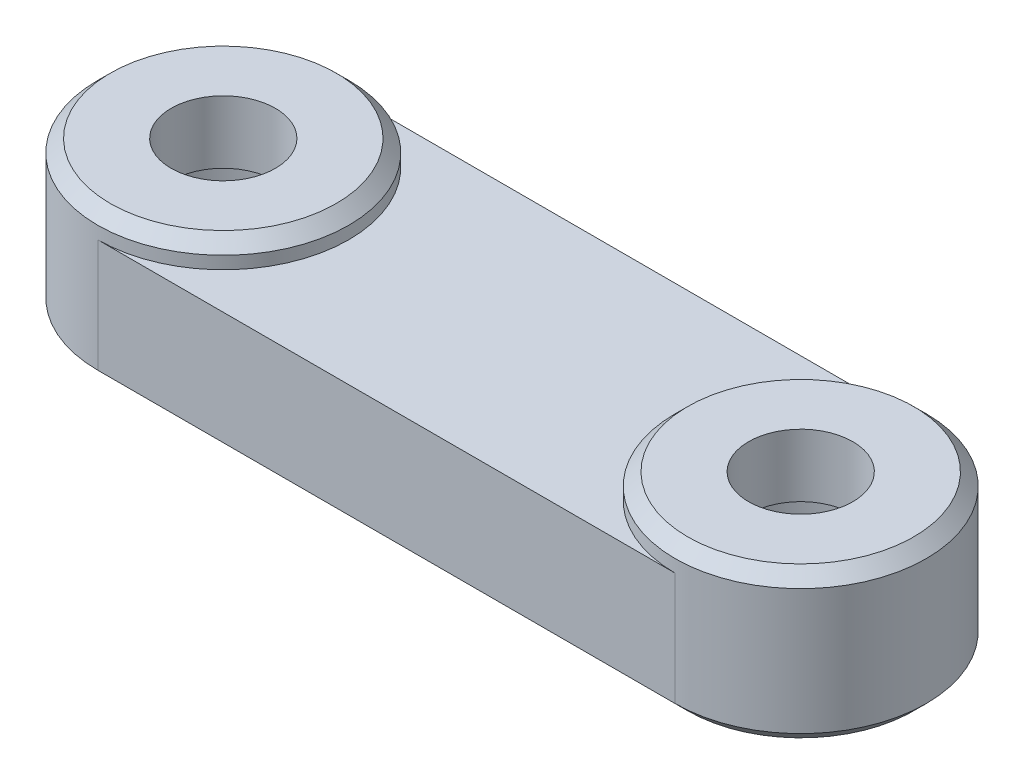
ISO-10303-21;
HEADER;
FILE_DESCRIPTION(('STEP AP214'),'2;1');
FILE_NAME('part.step','',(''),(''),'','','');
FILE_SCHEMA(('AUTOMOTIVE_DESIGN { 1 0 10303 214 1 1 1 1 }'));
ENDSEC;
DATA;
#1=APPLICATION_CONTEXT('core data for automotive mechanical design processes');
#2=APPLICATION_PROTOCOL_DEFINITION('international standard','automotive_design',2000,#1);
#3=PRODUCT_CONTEXT('',#1,'mechanical');
#4=PRODUCT('Part','Part','',(#3));
#5=PRODUCT_RELATED_PRODUCT_CATEGORY('part','',(#4));
#6=PRODUCT_DEFINITION_FORMATION('','',#4);
#7=PRODUCT_DEFINITION_CONTEXT('part definition',#1,'design');
#8=PRODUCT_DEFINITION('design','',#6,#7);
#9=PRODUCT_DEFINITION_SHAPE('','',#8);
#10=(LENGTH_UNIT() NAMED_UNIT(*) SI_UNIT(.MILLI.,.METRE.));
#11=(NAMED_UNIT(*) PLANE_ANGLE_UNIT() SI_UNIT($,.RADIAN.));
#12=(NAMED_UNIT(*) SI_UNIT($,.STERADIAN.) SOLID_ANGLE_UNIT());
#13=UNCERTAINTY_MEASURE_WITH_UNIT(LENGTH_MEASURE(1.E-05),#10,'distance_accuracy_value','');
#14=(GEOMETRIC_REPRESENTATION_CONTEXT(3) GLOBAL_UNCERTAINTY_ASSIGNED_CONTEXT((#13)) GLOBAL_UNIT_ASSIGNED_CONTEXT((#10,
#11,#12)) REPRESENTATION_CONTEXT('',''));
#15=CARTESIAN_POINT('',(0.,0.,0.));
#16=DIRECTION('',(0.,0.,1.));
#17=DIRECTION('',(1.,0.,0.));
#18=AXIS2_PLACEMENT_3D('',#15,#16,#17);
#19=CARTESIAN_POINT('',(0.,6.,5.));
#20=DIRECTION('',(0.,0.,-1.));
#21=DIRECTION('',(-1.,0.,0.));
#22=AXIS2_PLACEMENT_3D('',#19,#20,#21);
#23=PLANE('',#22);
#24=DIRECTION('',(0.,-1.,0.));
#25=VECTOR('',#24,1.);
#26=CARTESIAN_POINT('',(0.,6.,5.));
#27=LINE('',#26,#25);
#28=CARTESIAN_POINT('',(0.,5.,5.));
#29=VERTEX_POINT('',#28);
#30=CARTESIAN_POINT('',(0.,0.49999999999999,5.));
#31=VERTEX_POINT('',#30);
#32=EDGE_CURVE('E113',#29,#31,#27,.T.);
#33=ORIENTED_EDGE('',*,*,#32,.T.);
#34=DIRECTION('',(1.,0.,0.));
#35=VECTOR('',#34,1.);
#36=CARTESIAN_POINT('',(0.,0.49999999999999,5.));
#37=LINE('',#36,#35);
#38=CARTESIAN_POINT('',(23.,0.49999999999999,5.));
#39=VERTEX_POINT('',#38);
#40=EDGE_CURVE('E56',#31,#39,#37,.T.);
#41=ORIENTED_EDGE('',*,*,#40,.T.);
#42=DIRECTION('',(0.,-1.,0.));
#43=VECTOR('',#42,1.);
#44=CARTESIAN_POINT('',(23.,6.,5.));
#45=LINE('',#44,#43);
#46=CARTESIAN_POINT('',(23.,5.,5.));
#47=VERTEX_POINT('',#46);
#48=EDGE_CURVE('E108',#47,#39,#45,.T.);
#49=ORIENTED_EDGE('',*,*,#48,.F.);
#50=DIRECTION('',(1.,0.,0.));
#51=VECTOR('',#50,1.);
#52=CARTESIAN_POINT('',(0.,5.,5.));
#53=LINE('',#52,#51);
#54=EDGE_CURVE('E96',#29,#47,#53,.T.);
#55=ORIENTED_EDGE('',*,*,#54,.F.);
#56=EDGE_LOOP('',(#33,#41,#49,#55));
#57=FACE_BOUND('',#56,.T.);
#58=ADVANCED_FACE('F38',(#57),#23,.F.);
#59=CARTESIAN_POINT('',(0.,6.,-5.));
#60=DIRECTION('',(0.,0.,1.));
#61=DIRECTION('',(1.,0.,0.));
#62=AXIS2_PLACEMENT_3D('',#59,#60,#61);
#63=PLANE('',#62);
#64=DIRECTION('',(0.,-1.,0.));
#65=VECTOR('',#64,1.);
#66=CARTESIAN_POINT('',(23.,6.,-5.));
#67=LINE('',#66,#65);
#68=CARTESIAN_POINT('',(23.,5.,-5.));
#69=VERTEX_POINT('',#68);
#70=CARTESIAN_POINT('',(23.,0.49999999999999,-5.));
#71=VERTEX_POINT('',#70);
#72=EDGE_CURVE('E111',#69,#71,#67,.T.);
#73=ORIENTED_EDGE('',*,*,#72,.T.);
#74=DIRECTION('',(-1.,0.,0.));
#75=VECTOR('',#74,1.);
#76=CARTESIAN_POINT('',(0.,0.49999999999999,-5.));
#77=LINE('',#76,#75);
#78=CARTESIAN_POINT('',(0.,0.49999999999999,-5.));
#79=VERTEX_POINT('',#78);
#80=EDGE_CURVE('E122',#71,#79,#77,.T.);
#81=ORIENTED_EDGE('',*,*,#80,.T.);
#82=DIRECTION('',(0.,-1.,0.));
#83=VECTOR('',#82,1.);
#84=CARTESIAN_POINT('',(0.,6.,-5.));
#85=LINE('',#84,#83);
#86=CARTESIAN_POINT('',(0.,5.,-5.));
#87=VERTEX_POINT('',#86);
#88=EDGE_CURVE('E117',#87,#79,#85,.T.);
#89=ORIENTED_EDGE('',*,*,#88,.F.);
#90=DIRECTION('',(-1.,0.,0.));
#91=VECTOR('',#90,1.);
#92=CARTESIAN_POINT('',(0.,5.,-5.));
#93=LINE('',#92,#91);
#94=EDGE_CURVE('E115',#69,#87,#93,.T.);
#95=ORIENTED_EDGE('',*,*,#94,.F.);
#96=EDGE_LOOP('',(#73,#81,#89,#95));
#97=FACE_BOUND('',#96,.T.);
#98=ADVANCED_FACE('F174',(#97),#63,.F.);
#99=CARTESIAN_POINT('',(0.,6.,0.));
#100=DIRECTION('',(0.,1.,0.));
#101=DIRECTION('',(0.,0.,1.));
#102=AXIS2_PLACEMENT_3D('',#99,#100,#101);
#103=PLANE('',#102);
#104=CARTESIAN_POINT('',(0.,6.,0.));
#105=DIRECTION('',(0.,1.,0.));
#106=DIRECTION('',(0.,0.,1.));
#107=AXIS2_PLACEMENT_3D('',#104,#105,#106);
#108=CIRCLE('',#107,4.5);
#109=CARTESIAN_POINT('',(0.,6.,4.5));
#110=VERTEX_POINT('',#109);
#111=EDGE_CURVE('E48',#110,#110,#108,.T.);
#112=ORIENTED_EDGE('',*,*,#111,.T.);
#113=EDGE_LOOP('',(#112));
#114=FACE_BOUND('',#113,.T.);
#115=CARTESIAN_POINT('',(0.,6.,0.));
#116=DIRECTION('',(0.,1.,0.));
#117=DIRECTION('',(0.,0.,1.));
#118=AXIS2_PLACEMENT_3D('',#115,#116,#117);
#119=CIRCLE('',#118,2.075);
#120=CARTESIAN_POINT('',(0.,6.,2.075));
#121=VERTEX_POINT('',#120);
#122=EDGE_CURVE('E186',#121,#121,#119,.T.);
#123=ORIENTED_EDGE('',*,*,#122,.F.);
#124=EDGE_LOOP('',(#123));
#125=FACE_BOUND('',#124,.T.);
#126=ADVANCED_FACE('F222',(#114,#125),#103,.T.);
#127=CARTESIAN_POINT('',(23.,6.,0.));
#128=DIRECTION('',(0.,1.,0.));
#129=DIRECTION('',(0.,0.,1.));
#130=AXIS2_PLACEMENT_3D('',#127,#128,#129);
#131=CIRCLE('',#130,4.5);
#132=CARTESIAN_POINT('',(23.,6.,4.5));
#133=VERTEX_POINT('',#132);
#134=EDGE_CURVE('E11',#133,#133,#131,.T.);
#135=ORIENTED_EDGE('',*,*,#134,.T.);
#136=EDGE_LOOP('',(#135));
#137=FACE_BOUND('',#136,.T.);
#138=CARTESIAN_POINT('',(23.,6.,0.));
#139=DIRECTION('',(0.,-1.,0.));
#140=DIRECTION('',(0.,0.,-1.));
#141=AXIS2_PLACEMENT_3D('',#138,#139,#140);
#142=CIRCLE('',#141,2.075);
#143=CARTESIAN_POINT('',(23.,6.,-2.075));
#144=VERTEX_POINT('',#143);
#145=EDGE_CURVE('E103',#144,#144,#142,.T.);
#146=ORIENTED_EDGE('',*,*,#145,.T.);
#147=EDGE_LOOP('',(#146));
#148=FACE_BOUND('',#147,.T.);
#149=ADVANCED_FACE('F202',(#137,#148),#103,.T.);
#150=CARTESIAN_POINT('',(0.,6.,0.));
#151=DIRECTION('',(0.,-1.,0.));
#152=DIRECTION('',(0.,0.,-1.));
#153=AXIS2_PLACEMENT_3D('',#150,#151,#152);
#154=CYLINDRICAL_SURFACE('',#153,5.);
#155=CARTESIAN_POINT('',(0.,5.5,0.));
#156=DIRECTION('',(0.,1.,0.));
#157=DIRECTION('',(0.,0.,1.));
#158=AXIS2_PLACEMENT_3D('',#155,#156,#157);
#159=CIRCLE('',#158,5.);
#160=CARTESIAN_POINT('',(0.,5.5,5.));
#161=VERTEX_POINT('',#160);
#162=EDGE_CURVE('E134',#161,#161,#159,.F.);
#163=ORIENTED_EDGE('',*,*,#162,.T.);
#164=EDGE_LOOP('',(#163));
#165=FACE_BOUND('',#164,.T.);
#166=ORIENTED_EDGE('',*,*,#88,.T.);
#167=CARTESIAN_POINT('',(0.,0.49999999999999,0.));
#168=DIRECTION('',(0.,1.,0.));
#169=DIRECTION('',(0.,0.,1.));
#170=AXIS2_PLACEMENT_3D('',#167,#168,#169);
#171=CIRCLE('',#170,5.);
#172=EDGE_CURVE('E64',#79,#31,#171,.T.);
#173=ORIENTED_EDGE('',*,*,#172,.T.);
#174=ORIENTED_EDGE('',*,*,#32,.F.);
#175=CARTESIAN_POINT('',(0.,5.,0.));
#176=DIRECTION('',(0.,1.,0.));
#177=DIRECTION('',(0.,0.,1.));
#178=AXIS2_PLACEMENT_3D('',#175,#176,#177);
#179=CIRCLE('',#178,5.);
#180=EDGE_CURVE('E102',#29,#87,#179,.T.);
#181=ORIENTED_EDGE('',*,*,#180,.T.);
#182=EDGE_LOOP('',(#166,#173,#174,#181));
#183=FACE_BOUND('',#182,.T.);
#184=ADVANCED_FACE('F175',(#165,#183),#154,.T.);
#185=CARTESIAN_POINT('',(23.,6.,0.));
#186=DIRECTION('',(0.,-1.,0.));
#187=DIRECTION('',(0.,0.,-1.));
#188=AXIS2_PLACEMENT_3D('',#185,#186,#187);
#189=CYLINDRICAL_SURFACE('',#188,5.);
#190=CARTESIAN_POINT('',(23.,5.5,0.));
#191=DIRECTION('',(0.,1.,0.));
#192=DIRECTION('',(0.,0.,1.));
#193=AXIS2_PLACEMENT_3D('',#190,#191,#192);
#194=CIRCLE('',#193,5.);
#195=CARTESIAN_POINT('',(23.,5.5,5.));
#196=VERTEX_POINT('',#195);
#197=EDGE_CURVE('E138',#196,#196,#194,.F.);
#198=ORIENTED_EDGE('',*,*,#197,.T.);
#199=EDGE_LOOP('',(#198));
#200=FACE_BOUND('',#199,.T.);
#201=ORIENTED_EDGE('',*,*,#48,.T.);
#202=CARTESIAN_POINT('',(23.,0.49999999999999,0.));
#203=DIRECTION('',(0.,1.,0.));
#204=DIRECTION('',(0.,0.,1.));
#205=AXIS2_PLACEMENT_3D('',#202,#203,#204);
#206=CIRCLE('',#205,5.);
#207=EDGE_CURVE('E141',#39,#71,#206,.T.);
#208=ORIENTED_EDGE('',*,*,#207,.T.);
#209=ORIENTED_EDGE('',*,*,#72,.F.);
#210=CARTESIAN_POINT('',(23.,5.,0.));
#211=DIRECTION('',(0.,1.,0.));
#212=DIRECTION('',(0.,0.,1.));
#213=AXIS2_PLACEMENT_3D('',#210,#211,#212);
#214=CIRCLE('',#213,5.);
#215=EDGE_CURVE('E99',#69,#47,#214,.T.);
#216=ORIENTED_EDGE('',*,*,#215,.T.);
#217=EDGE_LOOP('',(#201,#208,#209,#216));
#218=FACE_BOUND('',#217,.T.);
#219=ADVANCED_FACE('F107',(#200,#218),#189,.T.);
#220=CARTESIAN_POINT('',(0.,0.,0.));
#221=DIRECTION('',(0.,1.,0.));
#222=DIRECTION('',(0.,0.,1.));
#223=AXIS2_PLACEMENT_3D('',#220,#221,#222);
#224=PLANE('',#223);
#225=CARTESIAN_POINT('',(0.,0.,0.));
#226=DIRECTION('',(0.,1.,0.));
#227=DIRECTION('',(0.,0.,1.));
#228=AXIS2_PLACEMENT_3D('',#225,#226,#227);
#229=CIRCLE('',#228,4.5);
#230=CARTESIAN_POINT('',(0.,0.,4.5));
#231=VERTEX_POINT('',#230);
#232=CARTESIAN_POINT('',(0.,0.,-4.5));
#233=VERTEX_POINT('',#232);
#234=EDGE_CURVE('E129',#231,#233,#229,.F.);
#235=ORIENTED_EDGE('',*,*,#234,.T.);
#236=DIRECTION('',(1.,0.,0.));
#237=VECTOR('',#236,1.);
#238=CARTESIAN_POINT('',(0.,0.,-4.5));
#239=LINE('',#238,#237);
#240=CARTESIAN_POINT('',(23.,0.,-4.5));
#241=VERTEX_POINT('',#240);
#242=EDGE_CURVE('E131',#233,#241,#239,.T.);
#243=ORIENTED_EDGE('',*,*,#242,.T.);
#244=CARTESIAN_POINT('',(23.,0.,0.));
#245=DIRECTION('',(0.,1.,0.));
#246=DIRECTION('',(0.,0.,1.));
#247=AXIS2_PLACEMENT_3D('',#244,#245,#246);
#248=CIRCLE('',#247,4.5);
#249=CARTESIAN_POINT('',(23.,0.,4.5));
#250=VERTEX_POINT('',#249);
#251=EDGE_CURVE('E127',#241,#250,#248,.F.);
#252=ORIENTED_EDGE('',*,*,#251,.T.);
#253=DIRECTION('',(-1.,0.,0.));
#254=VECTOR('',#253,1.);
#255=CARTESIAN_POINT('',(0.,0.,4.5));
#256=LINE('',#255,#254);
#257=EDGE_CURVE('E125',#250,#231,#256,.T.);
#258=ORIENTED_EDGE('',*,*,#257,.T.);
#259=EDGE_LOOP('',(#235,#243,#252,#258));
#260=FACE_BOUND('',#259,.T.);
#261=CARTESIAN_POINT('',(23.,0.,0.));
#262=DIRECTION('',(0.,-1.,0.));
#263=DIRECTION('',(0.,0.,-1.));
#264=AXIS2_PLACEMENT_3D('',#261,#262,#263);
#265=CIRCLE('',#264,3.75);
#266=CARTESIAN_POINT('',(23.,0.,-3.75));
#267=VERTEX_POINT('',#266);
#268=EDGE_CURVE('E189',#267,#267,#265,.T.);
#269=ORIENTED_EDGE('',*,*,#268,.F.);
#270=EDGE_LOOP('',(#269));
#271=FACE_BOUND('',#270,.T.);
#272=CARTESIAN_POINT('',(0.,0.,0.));
#273=DIRECTION('',(0.,1.,0.));
#274=DIRECTION('',(0.,0.,1.));
#275=AXIS2_PLACEMENT_3D('',#272,#273,#274);
#276=CIRCLE('',#275,3.75);
#277=CARTESIAN_POINT('',(0.,0.,3.75));
#278=VERTEX_POINT('',#277);
#279=EDGE_CURVE('E176',#278,#278,#276,.T.);
#280=ORIENTED_EDGE('',*,*,#279,.T.);
#281=EDGE_LOOP('',(#280));
#282=FACE_BOUND('',#281,.T.);
#283=ADVANCED_FACE('F164',(#260,#271,#282),#224,.F.);
#284=CARTESIAN_POINT('',(0.,6.,0.));
#285=DIRECTION('',(0.,1.,0.));
#286=DIRECTION('',(0.,0.,1.));
#287=AXIS2_PLACEMENT_3D('',#284,#285,#286);
#288=CYLINDRICAL_SURFACE('',#287,3.75);
#289=ORIENTED_EDGE('',*,*,#279,.F.);
#290=EDGE_LOOP('',(#289));
#291=FACE_BOUND('',#290,.T.);
#292=CARTESIAN_POINT('',(0.,3.5,0.));
#293=DIRECTION('',(0.,1.,0.));
#294=DIRECTION('',(0.,0.,1.));
#295=AXIS2_PLACEMENT_3D('',#292,#293,#294);
#296=CIRCLE('',#295,3.75);
#297=CARTESIAN_POINT('',(0.,3.5,3.75));
#298=VERTEX_POINT('',#297);
#299=EDGE_CURVE('E178',#298,#298,#296,.T.);
#300=ORIENTED_EDGE('',*,*,#299,.T.);
#301=EDGE_LOOP('',(#300));
#302=FACE_BOUND('',#301,.T.);
#303=ADVANCED_FACE('F278',(#291,#302),#288,.F.);
#304=CARTESIAN_POINT('',(-3.75,3.5,0.));
#305=DIRECTION('',(0.,1.,0.));
#306=DIRECTION('',(0.,0.,1.));
#307=AXIS2_PLACEMENT_3D('',#304,#305,#306);
#308=PLANE('',#307);
#309=ORIENTED_EDGE('',*,*,#299,.F.);
#310=EDGE_LOOP('',(#309));
#311=FACE_BOUND('',#310,.T.);
#312=CARTESIAN_POINT('',(0.,3.5,0.));
#313=DIRECTION('',(0.,1.,0.));
#314=DIRECTION('',(0.,0.,1.));
#315=AXIS2_PLACEMENT_3D('',#312,#313,#314);
#316=CIRCLE('',#315,2.075);
#317=CARTESIAN_POINT('',(0.,3.5,2.075));
#318=VERTEX_POINT('',#317);
#319=EDGE_CURVE('E183',#318,#318,#316,.T.);
#320=ORIENTED_EDGE('',*,*,#319,.T.);
#321=EDGE_LOOP('',(#320));
#322=FACE_BOUND('',#321,.T.);
#323=ADVANCED_FACE('F269',(#311,#322),#308,.F.);
#324=CARTESIAN_POINT('',(0.,6.,0.));
#325=DIRECTION('',(0.,1.,0.));
#326=DIRECTION('',(0.,0.,1.));
#327=AXIS2_PLACEMENT_3D('',#324,#325,#326);
#328=CYLINDRICAL_SURFACE('',#327,2.075);
#329=ORIENTED_EDGE('',*,*,#319,.F.);
#330=EDGE_LOOP('',(#329));
#331=FACE_BOUND('',#330,.T.);
#332=ORIENTED_EDGE('',*,*,#122,.T.);
#333=EDGE_LOOP('',(#332));
#334=FACE_BOUND('',#333,.T.);
#335=ADVANCED_FACE('F267',(#331,#334),#328,.F.);
#336=CARTESIAN_POINT('',(23.,0.,0.));
#337=DIRECTION('',(0.,-1.,0.));
#338=DIRECTION('',(0.,0.,-1.));
#339=AXIS2_PLACEMENT_3D('',#336,#337,#338);
#340=CYLINDRICAL_SURFACE('',#339,3.75);
#341=ORIENTED_EDGE('',*,*,#268,.T.);
#342=EDGE_LOOP('',(#341));
#343=FACE_BOUND('',#342,.T.);
#344=CARTESIAN_POINT('',(23.,3.5,0.));
#345=DIRECTION('',(0.,-1.,0.));
#346=DIRECTION('',(0.,0.,-1.));
#347=AXIS2_PLACEMENT_3D('',#344,#345,#346);
#348=CIRCLE('',#347,3.75);
#349=CARTESIAN_POINT('',(23.,3.5,-3.75));
#350=VERTEX_POINT('',#349);
#351=EDGE_CURVE('E192',#350,#350,#348,.T.);
#352=ORIENTED_EDGE('',*,*,#351,.F.);
#353=EDGE_LOOP('',(#352));
#354=FACE_BOUND('',#353,.T.);
#355=ADVANCED_FACE('F214',(#343,#354),#340,.F.);
#356=CARTESIAN_POINT('',(19.25,3.5,0.));
#357=DIRECTION('',(0.,-1.,0.));
#358=DIRECTION('',(0.,0.,-1.));
#359=AXIS2_PLACEMENT_3D('',#356,#357,#358);
#360=PLANE('',#359);
#361=ORIENTED_EDGE('',*,*,#351,.T.);
#362=EDGE_LOOP('',(#361));
#363=FACE_BOUND('',#362,.T.);
#364=CARTESIAN_POINT('',(23.,3.5,0.));
#365=DIRECTION('',(0.,-1.,0.));
#366=DIRECTION('',(0.,0.,-1.));
#367=AXIS2_PLACEMENT_3D('',#364,#365,#366);
#368=CIRCLE('',#367,2.075);
#369=CARTESIAN_POINT('',(23.,3.5,-2.075));
#370=VERTEX_POINT('',#369);
#371=EDGE_CURVE('E195',#370,#370,#368,.T.);
#372=ORIENTED_EDGE('',*,*,#371,.F.);
#373=EDGE_LOOP('',(#372));
#374=FACE_BOUND('',#373,.T.);
#375=ADVANCED_FACE('F206',(#363,#374),#360,.T.);
#376=CARTESIAN_POINT('',(23.,0.,0.));
#377=DIRECTION('',(0.,-1.,0.));
#378=DIRECTION('',(0.,0.,-1.));
#379=AXIS2_PLACEMENT_3D('',#376,#377,#378);
#380=CYLINDRICAL_SURFACE('',#379,2.075);
#381=ORIENTED_EDGE('',*,*,#371,.T.);
#382=EDGE_LOOP('',(#381));
#383=FACE_BOUND('',#382,.T.);
#384=ORIENTED_EDGE('',*,*,#145,.F.);
#385=EDGE_LOOP('',(#384));
#386=FACE_BOUND('',#385,.T.);
#387=ADVANCED_FACE('F204',(#383,#386),#380,.F.);
#388=CARTESIAN_POINT('',(0.,5.,0.));
#389=DIRECTION('',(0.,1.,0.));
#390=DIRECTION('',(0.,0.,1.));
#391=AXIS2_PLACEMENT_3D('',#388,#389,#390);
#392=PLANE('',#391);
#393=ORIENTED_EDGE('',*,*,#54,.T.);
#394=ORIENTED_EDGE('',*,*,#215,.F.);
#395=ORIENTED_EDGE('',*,*,#94,.T.);
#396=ORIENTED_EDGE('',*,*,#180,.F.);
#397=EDGE_LOOP('',(#393,#394,#395,#396));
#398=FACE_BOUND('',#397,.T.);
#399=ADVANCED_FACE('F98',(#398),#392,.T.);
#400=CARTESIAN_POINT('',(0.,0.49999999999999,5.));
#401=DIRECTION('',(0.,0.707106781186552,-0.707106781186543));
#402=DIRECTION('',(1.,0.,0.));
#403=AXIS2_PLACEMENT_3D('',#400,#401,#402);
#404=PLANE('',#403);
#405=DIRECTION('',(0.,0.707106781186543,0.707106781186552));
#406=VECTOR('',#405,1.);
#407=CARTESIAN_POINT('',(0.,0.,4.5));
#408=LINE('',#407,#406);
#409=EDGE_CURVE('E149',#231,#31,#408,.T.);
#410=ORIENTED_EDGE('',*,*,#409,.F.);
#411=ORIENTED_EDGE('',*,*,#257,.F.);
#412=DIRECTION('',(0.,-0.707106781186543,-0.707106781186552));
#413=VECTOR('',#412,1.);
#414=CARTESIAN_POINT('',(23.,0.49999999999999,5.));
#415=LINE('',#414,#413);
#416=EDGE_CURVE('E43',#39,#250,#415,.T.);
#417=ORIENTED_EDGE('',*,*,#416,.F.);
#418=ORIENTED_EDGE('',*,*,#40,.F.);
#419=EDGE_LOOP('',(#410,#411,#417,#418));
#420=FACE_BOUND('',#419,.T.);
#421=ADVANCED_FACE('F162',(#420),#404,.F.);
#422=CARTESIAN_POINT('',(23.,0.49999999999999,0.));
#423=DIRECTION('',(0.,1.,0.));
#424=DIRECTION('',(0.,0.,1.));
#425=AXIS2_PLACEMENT_3D('',#422,#423,#424);
#426=CONICAL_SURFACE('',#425,5.,0.785398163397455);
#427=ORIENTED_EDGE('',*,*,#416,.T.);
#428=ORIENTED_EDGE('',*,*,#251,.F.);
#429=DIRECTION('',(0.,-0.707106781186543,0.707106781186552));
#430=VECTOR('',#429,1.);
#431=CARTESIAN_POINT('',(23.,0.49999999999999,-5.));
#432=LINE('',#431,#430);
#433=EDGE_CURVE('E148',#71,#241,#432,.T.);
#434=ORIENTED_EDGE('',*,*,#433,.F.);
#435=ORIENTED_EDGE('',*,*,#207,.F.);
#436=EDGE_LOOP('',(#427,#428,#434,#435));
#437=FACE_BOUND('',#436,.T.);
#438=ADVANCED_FACE('F158',(#437),#426,.T.);
#439=CARTESIAN_POINT('',(0.,0.49999999999999,0.));
#440=DIRECTION('',(0.,1.,0.));
#441=DIRECTION('',(0.,0.,1.));
#442=AXIS2_PLACEMENT_3D('',#439,#440,#441);
#443=CONICAL_SURFACE('',#442,5.,0.785398163397455);
#444=ORIENTED_EDGE('',*,*,#409,.T.);
#445=ORIENTED_EDGE('',*,*,#172,.F.);
#446=DIRECTION('',(0.,0.707106781186543,-0.707106781186552));
#447=VECTOR('',#446,1.);
#448=CARTESIAN_POINT('',(0.,0.,-4.5));
#449=LINE('',#448,#447);
#450=EDGE_CURVE('E146',#233,#79,#449,.T.);
#451=ORIENTED_EDGE('',*,*,#450,.F.);
#452=ORIENTED_EDGE('',*,*,#234,.F.);
#453=EDGE_LOOP('',(#444,#445,#451,#452));
#454=FACE_BOUND('',#453,.T.);
#455=ADVANCED_FACE('F171',(#454),#443,.T.);
#456=CARTESIAN_POINT('',(0.,0.49999999999999,-5.));
#457=DIRECTION('',(0.,0.707106781186552,0.707106781186543));
#458=DIRECTION('',(-1.,0.,0.));
#459=AXIS2_PLACEMENT_3D('',#456,#457,#458);
#460=PLANE('',#459);
#461=ORIENTED_EDGE('',*,*,#433,.T.);
#462=ORIENTED_EDGE('',*,*,#242,.F.);
#463=ORIENTED_EDGE('',*,*,#450,.T.);
#464=ORIENTED_EDGE('',*,*,#80,.F.);
#465=EDGE_LOOP('',(#461,#462,#463,#464));
#466=FACE_BOUND('',#465,.T.);
#467=ADVANCED_FACE('F169',(#466),#460,.F.);
#468=CARTESIAN_POINT('',(0.,6.,0.));
#469=DIRECTION('',(0.,-1.,0.));
#470=DIRECTION('',(0.,0.,-1.));
#471=AXIS2_PLACEMENT_3D('',#468,#469,#470);
#472=CONICAL_SURFACE('',#471,4.5,0.785398163397441);
#473=ORIENTED_EDGE('',*,*,#162,.F.);
#474=EDGE_LOOP('',(#473));
#475=FACE_BOUND('',#474,.T.);
#476=ORIENTED_EDGE('',*,*,#111,.F.);
#477=EDGE_LOOP('',(#476));
#478=FACE_BOUND('',#477,.T.);
#479=ADVANCED_FACE('F236',(#475,#478),#472,.T.);
#480=CARTESIAN_POINT('',(23.,6.,0.));
#481=DIRECTION('',(0.,-1.,0.));
#482=DIRECTION('',(0.,0.,-1.));
#483=AXIS2_PLACEMENT_3D('',#480,#481,#482);
#484=CONICAL_SURFACE('',#483,4.5,0.785398163397441);
#485=ORIENTED_EDGE('',*,*,#197,.F.);
#486=EDGE_LOOP('',(#485));
#487=FACE_BOUND('',#486,.T.);
#488=ORIENTED_EDGE('',*,*,#134,.F.);
#489=EDGE_LOOP('',(#488));
#490=FACE_BOUND('',#489,.T.);
#491=ADVANCED_FACE('F41',(#487,#490),#484,.T.);
#492=CLOSED_SHELL('',(#58,#98,#126,#149,#184,#219,#283,#303,#323,#335,#355,#375,#387,#399,#421,
#438,#455,#467,#479,#491));
#493=MANIFOLD_SOLID_BREP('B2',#492);
#494=ADVANCED_BREP_SHAPE_REPRESENTATION('',(#18,#493),#14);
#495=SHAPE_DEFINITION_REPRESENTATION(#9,#494);
ENDSEC;
END-ISO-10303-21;
